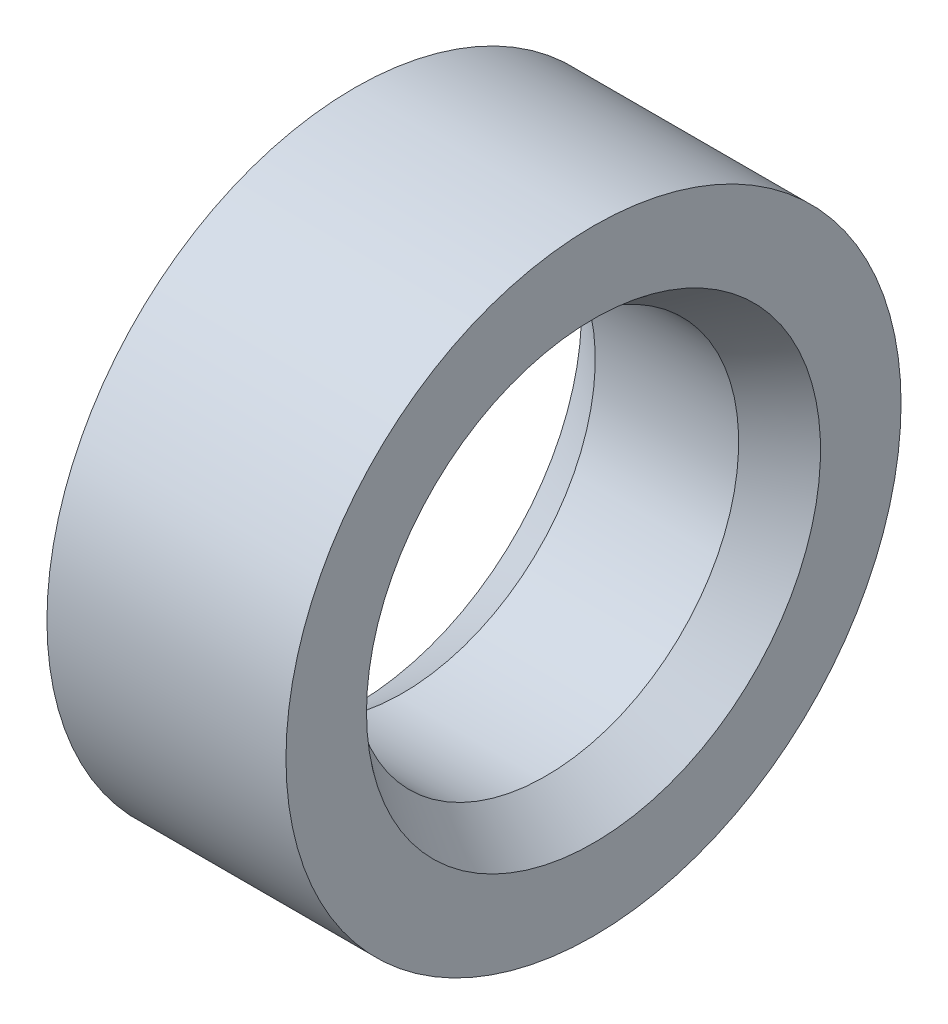
ISO-10303-21;
HEADER;
FILE_DESCRIPTION(('STEP AP214'),'2;1');
FILE_NAME('part.step','',(''),(''),'','','');
FILE_SCHEMA(('AUTOMOTIVE_DESIGN { 1 0 10303 214 1 1 1 1 }'));
ENDSEC;
DATA;
#1=APPLICATION_CONTEXT('core data for automotive mechanical design processes');
#2=APPLICATION_PROTOCOL_DEFINITION('international standard','automotive_design',2000,#1);
#3=PRODUCT_CONTEXT('',#1,'mechanical');
#4=PRODUCT('Part','Part','',(#3));
#5=PRODUCT_RELATED_PRODUCT_CATEGORY('part','',(#4));
#6=PRODUCT_DEFINITION_FORMATION('','',#4);
#7=PRODUCT_DEFINITION_CONTEXT('part definition',#1,'design');
#8=PRODUCT_DEFINITION('design','',#6,#7);
#9=PRODUCT_DEFINITION_SHAPE('','',#8);
#10=(LENGTH_UNIT() NAMED_UNIT(*) SI_UNIT(.MILLI.,.METRE.));
#11=(NAMED_UNIT(*) PLANE_ANGLE_UNIT() SI_UNIT($,.RADIAN.));
#12=(NAMED_UNIT(*) SI_UNIT($,.STERADIAN.) SOLID_ANGLE_UNIT());
#13=UNCERTAINTY_MEASURE_WITH_UNIT(LENGTH_MEASURE(1.E-05),#10,'distance_accuracy_value','');
#14=(GEOMETRIC_REPRESENTATION_CONTEXT(3) GLOBAL_UNCERTAINTY_ASSIGNED_CONTEXT((#13)) GLOBAL_UNIT_ASSIGNED_CONTEXT((#10,
#11,#12)) REPRESENTATION_CONTEXT('',''));
#15=CARTESIAN_POINT('',(0.,0.,0.));
#16=DIRECTION('',(0.,0.,1.));
#17=DIRECTION('',(1.,0.,0.));
#18=AXIS2_PLACEMENT_3D('',#15,#16,#17);
#19=CARTESIAN_POINT('',(-10.8471129087959,0.,0.));
#20=DIRECTION('',(-1.,0.,0.));
#21=DIRECTION('',(0.,0.,1.));
#22=AXIS2_PLACEMENT_3D('',#19,#20,#21);
#23=CONICAL_SURFACE('',#22,5.,0.618951358664964);
#24=CARTESIAN_POINT('',(-9.79422581759182,0.,0.));
#25=DIRECTION('',(-1.,0.,0.));
#26=DIRECTION('',(0.,0.,1.));
#27=AXIS2_PLACEMENT_3D('',#24,#25,#26);
#28=CIRCLE('',#27,4.25);
#29=CARTESIAN_POINT('',(-9.79422581759182,0.,4.25));
#30=VERTEX_POINT('',#29);
#31=EDGE_CURVE('E10',#30,#30,#28,.T.);
#32=ORIENTED_EDGE('',*,*,#31,.F.);
#33=EDGE_LOOP('',(#32));
#34=FACE_BOUND('',#33,.T.);
#35=CARTESIAN_POINT('',(-10.8471129087959,0.,0.));
#36=DIRECTION('',(-1.,0.,0.));
#37=DIRECTION('',(0.,0.,1.));
#38=AXIS2_PLACEMENT_3D('',#35,#36,#37);
#39=CIRCLE('',#38,5.);
#40=CARTESIAN_POINT('',(-10.8471129087959,0.,5.));
#41=VERTEX_POINT('',#40);
#42=EDGE_CURVE('E55',#41,#41,#39,.T.);
#43=ORIENTED_EDGE('',*,*,#42,.T.);
#44=EDGE_LOOP('',(#43));
#45=FACE_BOUND('',#44,.T.);
#46=ADVANCED_FACE('F33',(#34,#45),#23,.F.);
#47=CARTESIAN_POINT('',(-1000.,0.,0.));
#48=DIRECTION('',(-1.,0.,0.));
#49=DIRECTION('',(0.,0.,1.));
#50=AXIS2_PLACEMENT_3D('',#47,#48,#49);
#51=CYLINDRICAL_SURFACE('',#50,4.25);
#52=CARTESIAN_POINT('',(-6.6355645439794,0.,0.));
#53=DIRECTION('',(-1.,0.,0.));
#54=DIRECTION('',(0.,0.,1.));
#55=AXIS2_PLACEMENT_3D('',#52,#53,#54);
#56=CIRCLE('',#55,4.25);
#57=CARTESIAN_POINT('',(-6.6355645439794,0.,4.25));
#58=VERTEX_POINT('',#57);
#59=EDGE_CURVE('E39',#58,#58,#56,.T.);
#60=ORIENTED_EDGE('',*,*,#59,.F.);
#61=EDGE_LOOP('',(#60));
#62=FACE_BOUND('',#61,.T.);
#63=ORIENTED_EDGE('',*,*,#31,.T.);
#64=EDGE_LOOP('',(#63));
#65=FACE_BOUND('',#64,.T.);
#66=ADVANCED_FACE('F80',(#62,#65),#51,.F.);
#67=CARTESIAN_POINT('',(-6.6355645439794,0.,0.));
#68=DIRECTION('',(1.,0.,0.));
#69=DIRECTION('',(0.,0.,-1.));
#70=AXIS2_PLACEMENT_3D('',#67,#68,#69);
#71=CONICAL_SURFACE('',#70,4.25,0.618951358664964);
#72=CARTESIAN_POINT('',(-5.5826774527753,0.,0.));
#73=DIRECTION('',(-1.,0.,0.));
#74=DIRECTION('',(0.,0.,1.));
#75=AXIS2_PLACEMENT_3D('',#72,#73,#74);
#76=CIRCLE('',#75,5.);
#77=CARTESIAN_POINT('',(-5.5826774527753,0.,5.));
#78=VERTEX_POINT('',#77);
#79=EDGE_CURVE('E43',#78,#78,#76,.T.);
#80=ORIENTED_EDGE('',*,*,#79,.F.);
#81=EDGE_LOOP('',(#80));
#82=FACE_BOUND('',#81,.T.);
#83=ORIENTED_EDGE('',*,*,#59,.T.);
#84=EDGE_LOOP('',(#83));
#85=FACE_BOUND('',#84,.T.);
#86=ADVANCED_FACE('F75',(#82,#85),#71,.F.);
#87=CARTESIAN_POINT('',(-5.58267745277534,6.77355645439794,0.));
#88=DIRECTION('',(-1.,0.,0.));
#89=DIRECTION('',(0.,0.,1.));
#90=AXIS2_PLACEMENT_3D('',#87,#88,#89);
#91=PLANE('',#90);
#92=CARTESIAN_POINT('',(-5.5826774527753,0.,0.));
#93=DIRECTION('',(-1.,0.,0.));
#94=DIRECTION('',(0.,0.,1.));
#95=AXIS2_PLACEMENT_3D('',#92,#93,#94);
#96=CIRCLE('',#95,6.77355645439794);
#97=CARTESIAN_POINT('',(-5.5826774527753,0.,6.77355645439794));
#98=VERTEX_POINT('',#97);
#99=EDGE_CURVE('E47',#98,#98,#96,.T.);
#100=ORIENTED_EDGE('',*,*,#99,.F.);
#101=EDGE_LOOP('',(#100));
#102=FACE_BOUND('',#101,.T.);
#103=ORIENTED_EDGE('',*,*,#79,.T.);
#104=EDGE_LOOP('',(#103));
#105=FACE_BOUND('',#104,.T.);
#106=ADVANCED_FACE('F69',(#102,#105),#91,.F.);
#107=CARTESIAN_POINT('',(-1000.,0.,0.));
#108=DIRECTION('',(-1.,0.,0.));
#109=DIRECTION('',(0.,0.,1.));
#110=AXIS2_PLACEMENT_3D('',#107,#108,#109);
#111=CYLINDRICAL_SURFACE('',#110,6.77355645439794);
#112=CARTESIAN_POINT('',(-10.8471129087959,0.,0.));
#113=DIRECTION('',(-1.,0.,0.));
#114=DIRECTION('',(0.,0.,1.));
#115=AXIS2_PLACEMENT_3D('',#112,#113,#114);
#116=CIRCLE('',#115,6.77355645439794);
#117=CARTESIAN_POINT('',(-10.8471129087959,0.,6.77355645439794));
#118=VERTEX_POINT('',#117);
#119=EDGE_CURVE('E52',#118,#118,#116,.T.);
#120=ORIENTED_EDGE('',*,*,#119,.F.);
#121=EDGE_LOOP('',(#120));
#122=FACE_BOUND('',#121,.T.);
#123=ORIENTED_EDGE('',*,*,#99,.T.);
#124=EDGE_LOOP('',(#123));
#125=FACE_BOUND('',#124,.T.);
#126=ADVANCED_FACE('F63',(#122,#125),#111,.T.);
#127=CARTESIAN_POINT('',(-10.8471129087959,5.,0.));
#128=DIRECTION('',(1.,0.,0.));
#129=DIRECTION('',(0.,0.,-1.));
#130=AXIS2_PLACEMENT_3D('',#127,#128,#129);
#131=PLANE('',#130);
#132=ORIENTED_EDGE('',*,*,#42,.F.);
#133=EDGE_LOOP('',(#132));
#134=FACE_BOUND('',#133,.T.);
#135=ORIENTED_EDGE('',*,*,#119,.T.);
#136=EDGE_LOOP('',(#135));
#137=FACE_BOUND('',#136,.T.);
#138=ADVANCED_FACE('F60',(#134,#137),#131,.F.);
#139=CLOSED_SHELL('',(#46,#66,#86,#106,#126,#138));
#140=MANIFOLD_SOLID_BREP('B2',#139);
#141=ADVANCED_BREP_SHAPE_REPRESENTATION('',(#18,#140),#14);
#142=SHAPE_DEFINITION_REPRESENTATION(#9,#141);
ENDSEC;
END-ISO-10303-21;
